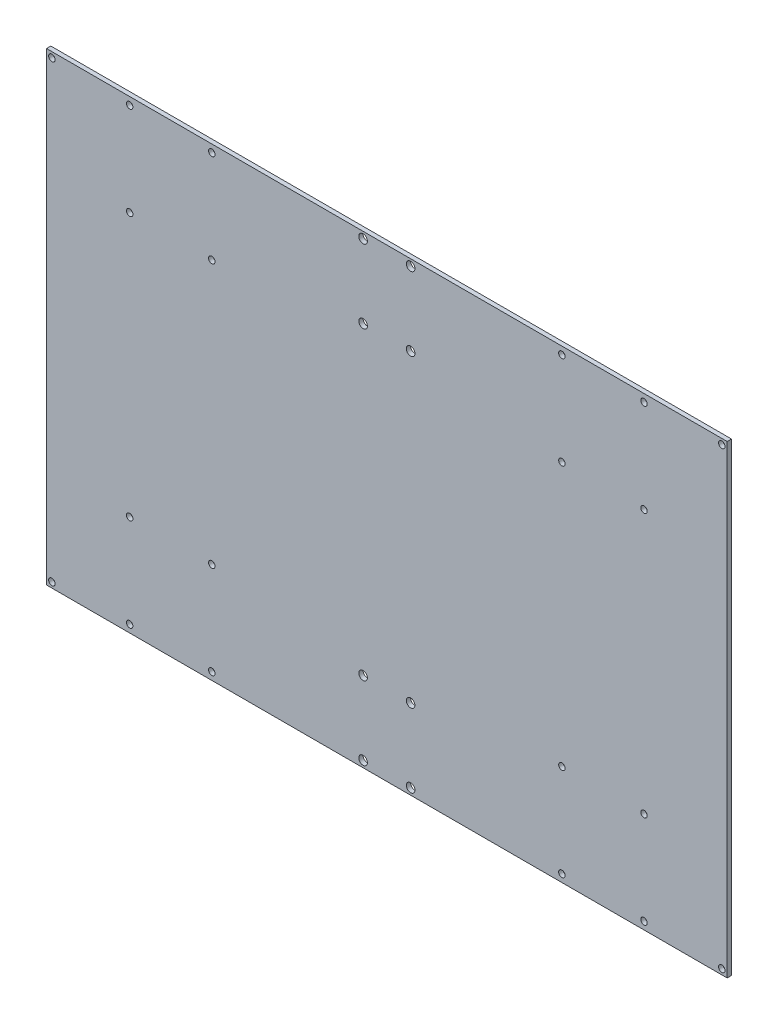
ISO-10303-21;
HEADER;
FILE_DESCRIPTION(('STEP AP214'),'2;1');
FILE_NAME('part.step','',(''),(''),'','','');
FILE_SCHEMA(('AUTOMOTIVE_DESIGN { 1 0 10303 214 1 1 1 1 }'));
ENDSEC;
DATA;
#1=APPLICATION_CONTEXT('core data for automotive mechanical design processes');
#2=APPLICATION_PROTOCOL_DEFINITION('international standard','automotive_design',2000,#1);
#3=PRODUCT_CONTEXT('',#1,'mechanical');
#4=PRODUCT('Part','Part','',(#3));
#5=PRODUCT_RELATED_PRODUCT_CATEGORY('part','',(#4));
#6=PRODUCT_DEFINITION_FORMATION('','',#4);
#7=PRODUCT_DEFINITION_CONTEXT('part definition',#1,'design');
#8=PRODUCT_DEFINITION('design','',#6,#7);
#9=PRODUCT_DEFINITION_SHAPE('','',#8);
#10=(LENGTH_UNIT() NAMED_UNIT(*) SI_UNIT(.MILLI.,.METRE.));
#11=(NAMED_UNIT(*) PLANE_ANGLE_UNIT() SI_UNIT($,.RADIAN.));
#12=(NAMED_UNIT(*) SI_UNIT($,.STERADIAN.) SOLID_ANGLE_UNIT());
#13=UNCERTAINTY_MEASURE_WITH_UNIT(LENGTH_MEASURE(1.E-05),#10,'distance_accuracy_value','');
#14=(GEOMETRIC_REPRESENTATION_CONTEXT(3) GLOBAL_UNCERTAINTY_ASSIGNED_CONTEXT((#13)) GLOBAL_UNIT_ASSIGNED_CONTEXT((#10,
#11,#12)) REPRESENTATION_CONTEXT('',''));
#15=CARTESIAN_POINT('',(0.,0.,0.));
#16=DIRECTION('',(0.,0.,1.));
#17=DIRECTION('',(1.,0.,0.));
#18=AXIS2_PLACEMENT_3D('',#15,#16,#17);
#19=CARTESIAN_POINT('',(157.5,-107.5,2.));
#20=DIRECTION('',(-1.,0.,0.));
#21=DIRECTION('',(0.,0.,1.));
#22=AXIS2_PLACEMENT_3D('',#19,#20,#21);
#23=PLANE('',#22);
#24=DIRECTION('',(0.,1.,0.));
#25=VECTOR('',#24,1.);
#26=CARTESIAN_POINT('',(157.5,-107.5,0.));
#27=LINE('',#26,#25);
#28=CARTESIAN_POINT('',(157.5,-107.5,0.));
#29=VERTEX_POINT('',#28);
#30=CARTESIAN_POINT('',(157.5,107.5,0.));
#31=VERTEX_POINT('',#30);
#32=EDGE_CURVE('E97',#29,#31,#27,.T.);
#33=ORIENTED_EDGE('',*,*,#32,.T.);
#34=DIRECTION('',(0.,0.,-1.));
#35=VECTOR('',#34,1.);
#36=CARTESIAN_POINT('',(157.5,107.5,2.));
#37=LINE('',#36,#35);
#38=CARTESIAN_POINT('',(157.5,107.5,2.));
#39=VERTEX_POINT('',#38);
#40=EDGE_CURVE('E11',#39,#31,#37,.T.);
#41=ORIENTED_EDGE('',*,*,#40,.F.);
#42=DIRECTION('',(0.,1.,0.));
#43=VECTOR('',#42,1.);
#44=CARTESIAN_POINT('',(157.5,-107.5,2.));
#45=LINE('',#44,#43);
#46=CARTESIAN_POINT('',(157.5,-107.5,2.));
#47=VERTEX_POINT('',#46);
#48=EDGE_CURVE('E85',#47,#39,#45,.T.);
#49=ORIENTED_EDGE('',*,*,#48,.F.);
#50=DIRECTION('',(0.,0.,-1.));
#51=VECTOR('',#50,1.);
#52=CARTESIAN_POINT('',(157.5,-107.5,2.));
#53=LINE('',#52,#51);
#54=EDGE_CURVE('E93',#47,#29,#53,.T.);
#55=ORIENTED_EDGE('',*,*,#54,.T.);
#56=EDGE_LOOP('',(#33,#41,#49,#55));
#57=FACE_BOUND('',#56,.T.);
#58=ADVANCED_FACE('F34',(#57),#23,.F.);
#59=CARTESIAN_POINT('',(-157.5,107.5,2.));
#60=DIRECTION('',(0.,-1.,0.));
#61=DIRECTION('',(0.,0.,-1.));
#62=AXIS2_PLACEMENT_3D('',#59,#60,#61);
#63=PLANE('',#62);
#64=DIRECTION('',(-1.,0.,0.));
#65=VECTOR('',#64,1.);
#66=CARTESIAN_POINT('',(-157.5,107.5,0.));
#67=LINE('',#66,#65);
#68=CARTESIAN_POINT('',(-157.5,107.5,0.));
#69=VERTEX_POINT('',#68);
#70=EDGE_CURVE('E89',#31,#69,#67,.T.);
#71=ORIENTED_EDGE('',*,*,#70,.T.);
#72=DIRECTION('',(0.,0.,-1.));
#73=VECTOR('',#72,1.);
#74=CARTESIAN_POINT('',(-157.5,107.5,2.));
#75=LINE('',#74,#73);
#76=CARTESIAN_POINT('',(-157.5,107.5,2.));
#77=VERTEX_POINT('',#76);
#78=EDGE_CURVE('E42',#77,#69,#75,.T.);
#79=ORIENTED_EDGE('',*,*,#78,.F.);
#80=DIRECTION('',(-1.,0.,0.));
#81=VECTOR('',#80,1.);
#82=CARTESIAN_POINT('',(-157.5,107.5,2.));
#83=LINE('',#82,#81);
#84=EDGE_CURVE('E80',#39,#77,#83,.T.);
#85=ORIENTED_EDGE('',*,*,#84,.F.);
#86=ORIENTED_EDGE('',*,*,#40,.T.);
#87=EDGE_LOOP('',(#71,#79,#85,#86));
#88=FACE_BOUND('',#87,.T.);
#89=ADVANCED_FACE('F88',(#88),#63,.F.);
#90=CARTESIAN_POINT('',(-157.5,-107.5,2.));
#91=DIRECTION('',(1.,0.,0.));
#92=DIRECTION('',(0.,0.,-1.));
#93=AXIS2_PLACEMENT_3D('',#90,#91,#92);
#94=PLANE('',#93);
#95=DIRECTION('',(0.,-1.,0.));
#96=VECTOR('',#95,1.);
#97=CARTESIAN_POINT('',(-157.5,-107.5,0.));
#98=LINE('',#97,#96);
#99=CARTESIAN_POINT('',(-157.5,-107.5,0.));
#100=VERTEX_POINT('',#99);
#101=EDGE_CURVE('E67',#69,#100,#98,.T.);
#102=ORIENTED_EDGE('',*,*,#101,.T.);
#103=DIRECTION('',(0.,0.,-1.));
#104=VECTOR('',#103,1.);
#105=CARTESIAN_POINT('',(-157.5,-107.5,2.));
#106=LINE('',#105,#104);
#107=CARTESIAN_POINT('',(-157.5,-107.5,2.));
#108=VERTEX_POINT('',#107);
#109=EDGE_CURVE('E90',#108,#100,#106,.T.);
#110=ORIENTED_EDGE('',*,*,#109,.F.);
#111=DIRECTION('',(0.,-1.,0.));
#112=VECTOR('',#111,1.);
#113=CARTESIAN_POINT('',(-157.5,-107.5,2.));
#114=LINE('',#113,#112);
#115=EDGE_CURVE('E83',#77,#108,#114,.T.);
#116=ORIENTED_EDGE('',*,*,#115,.F.);
#117=ORIENTED_EDGE('',*,*,#78,.T.);
#118=EDGE_LOOP('',(#102,#110,#116,#117));
#119=FACE_BOUND('',#118,.T.);
#120=ADVANCED_FACE('F91',(#119),#94,.F.);
#121=CARTESIAN_POINT('',(-157.5,-107.5,2.));
#122=DIRECTION('',(0.,1.,0.));
#123=DIRECTION('',(0.,0.,1.));
#124=AXIS2_PLACEMENT_3D('',#121,#122,#123);
#125=PLANE('',#124);
#126=DIRECTION('',(1.,0.,0.));
#127=VECTOR('',#126,1.);
#128=CARTESIAN_POINT('',(-157.5,-107.5,0.));
#129=LINE('',#128,#127);
#130=EDGE_CURVE('E73',#100,#29,#129,.T.);
#131=ORIENTED_EDGE('',*,*,#130,.T.);
#132=ORIENTED_EDGE('',*,*,#54,.F.);
#133=DIRECTION('',(1.,0.,0.));
#134=VECTOR('',#133,1.);
#135=CARTESIAN_POINT('',(-157.5,-107.5,2.));
#136=LINE('',#135,#134);
#137=EDGE_CURVE('E50',#108,#47,#136,.T.);
#138=ORIENTED_EDGE('',*,*,#137,.F.);
#139=ORIENTED_EDGE('',*,*,#109,.T.);
#140=EDGE_LOOP('',(#131,#132,#138,#139));
#141=FACE_BOUND('',#140,.T.);
#142=ADVANCED_FACE('F105',(#141),#125,.F.);
#143=CARTESIAN_POINT('',(0.,0.,2.));
#144=DIRECTION('',(0.,0.,-1.));
#145=DIRECTION('',(-1.,0.,0.));
#146=AXIS2_PLACEMENT_3D('',#143,#144,#145);
#147=PLANE('',#146);
#148=CARTESIAN_POINT('',(11.0000000000002,-104.5,2.));
#149=DIRECTION('',(0.,0.,1.));
#150=DIRECTION('',(1.,0.,0.));
#151=AXIS2_PLACEMENT_3D('',#148,#149,#150);
#152=CIRCLE('',#151,2.00000000000001);
#153=CARTESIAN_POINT('',(13.0000000000002,-104.5,2.));
#154=VERTEX_POINT('',#153);
#155=EDGE_CURVE('E273',#154,#154,#152,.T.);
#156=ORIENTED_EDGE('',*,*,#155,.F.);
#157=EDGE_LOOP('',(#156));
#158=FACE_BOUND('',#157,.T.);
#159=CARTESIAN_POINT('',(-10.9999999999998,-104.5,2.));
#160=DIRECTION('',(0.,0.,1.));
#161=DIRECTION('',(1.,0.,0.));
#162=AXIS2_PLACEMENT_3D('',#159,#160,#161);
#163=CIRCLE('',#162,2.00000000000001);
#164=CARTESIAN_POINT('',(-8.99999999999978,-104.5,2.));
#165=VERTEX_POINT('',#164);
#166=EDGE_CURVE('E267',#165,#165,#163,.T.);
#167=ORIENTED_EDGE('',*,*,#166,.F.);
#168=EDGE_LOOP('',(#167));
#169=FACE_BOUND('',#168,.T.);
#170=CARTESIAN_POINT('',(11.0000000000002,-70.5,2.));
#171=DIRECTION('',(0.,0.,1.));
#172=DIRECTION('',(1.,0.,0.));
#173=AXIS2_PLACEMENT_3D('',#170,#171,#172);
#174=CIRCLE('',#173,2.);
#175=CARTESIAN_POINT('',(13.0000000000002,-70.5,2.));
#176=VERTEX_POINT('',#175);
#177=EDGE_CURVE('E261',#176,#176,#174,.T.);
#178=ORIENTED_EDGE('',*,*,#177,.F.);
#179=EDGE_LOOP('',(#178));
#180=FACE_BOUND('',#179,.T.);
#181=CARTESIAN_POINT('',(-10.9999999999998,-70.5,2.));
#182=DIRECTION('',(0.,0.,1.));
#183=DIRECTION('',(1.,0.,0.));
#184=AXIS2_PLACEMENT_3D('',#181,#182,#183);
#185=CIRCLE('',#184,2.);
#186=CARTESIAN_POINT('',(-8.99999999999977,-70.5,2.));
#187=VERTEX_POINT('',#186);
#188=EDGE_CURVE('E255',#187,#187,#185,.T.);
#189=ORIENTED_EDGE('',*,*,#188,.F.);
#190=EDGE_LOOP('',(#189));
#191=FACE_BOUND('',#190,.T.);
#192=CARTESIAN_POINT('',(11.0000000000003,70.4999999999999,2.));
#193=DIRECTION('',(0.,0.,1.));
#194=DIRECTION('',(1.,0.,0.));
#195=AXIS2_PLACEMENT_3D('',#192,#193,#194);
#196=CIRCLE('',#195,2.);
#197=CARTESIAN_POINT('',(13.0000000000003,70.4999999999999,2.));
#198=VERTEX_POINT('',#197);
#199=EDGE_CURVE('E249',#198,#198,#196,.T.);
#200=ORIENTED_EDGE('',*,*,#199,.F.);
#201=EDGE_LOOP('',(#200));
#202=FACE_BOUND('',#201,.T.);
#203=CARTESIAN_POINT('',(-10.9999999999997,70.4999999999998,2.));
#204=DIRECTION('',(0.,0.,1.));
#205=DIRECTION('',(1.,0.,0.));
#206=AXIS2_PLACEMENT_3D('',#203,#204,#205);
#207=CIRCLE('',#206,2.);
#208=CARTESIAN_POINT('',(-8.99999999999967,70.4999999999998,2.));
#209=VERTEX_POINT('',#208);
#210=EDGE_CURVE('E243',#209,#209,#207,.T.);
#211=ORIENTED_EDGE('',*,*,#210,.F.);
#212=EDGE_LOOP('',(#211));
#213=FACE_BOUND('',#212,.T.);
#214=CARTESIAN_POINT('',(11.0000000000003,104.5,2.));
#215=DIRECTION('',(0.,0.,1.));
#216=DIRECTION('',(1.,0.,0.));
#217=AXIS2_PLACEMENT_3D('',#214,#215,#216);
#218=CIRCLE('',#217,2.);
#219=CARTESIAN_POINT('',(13.0000000000003,104.5,2.));
#220=VERTEX_POINT('',#219);
#221=EDGE_CURVE('E237',#220,#220,#218,.T.);
#222=ORIENTED_EDGE('',*,*,#221,.F.);
#223=EDGE_LOOP('',(#222));
#224=FACE_BOUND('',#223,.T.);
#225=CARTESIAN_POINT('',(-10.9999999999997,104.5,2.));
#226=DIRECTION('',(0.,0.,1.));
#227=DIRECTION('',(1.,0.,0.));
#228=AXIS2_PLACEMENT_3D('',#225,#226,#227);
#229=CIRCLE('',#228,2.);
#230=CARTESIAN_POINT('',(-8.99999999999967,104.5,2.));
#231=VERTEX_POINT('',#230);
#232=EDGE_CURVE('E231',#231,#231,#229,.T.);
#233=ORIENTED_EDGE('',*,*,#232,.F.);
#234=EDGE_LOOP('',(#233));
#235=FACE_BOUND('',#234,.T.);
#236=CARTESIAN_POINT('',(-119.,-104.,2.));
#237=DIRECTION('',(0.,0.,1.));
#238=DIRECTION('',(1.,0.,0.));
#239=AXIS2_PLACEMENT_3D('',#236,#237,#238);
#240=CIRCLE('',#239,1.5);
#241=CARTESIAN_POINT('',(-117.5,-104.,2.));
#242=VERTEX_POINT('',#241);
#243=EDGE_CURVE('E225',#242,#242,#240,.T.);
#244=ORIENTED_EDGE('',*,*,#243,.F.);
#245=EDGE_LOOP('',(#244));
#246=FACE_BOUND('',#245,.T.);
#247=CARTESIAN_POINT('',(-80.9999999999999,-104.,2.));
#248=DIRECTION('',(0.,0.,1.));
#249=DIRECTION('',(1.,0.,0.));
#250=AXIS2_PLACEMENT_3D('',#247,#248,#249);
#251=CIRCLE('',#250,1.5);
#252=CARTESIAN_POINT('',(-79.4999999999999,-104.,2.));
#253=VERTEX_POINT('',#252);
#254=EDGE_CURVE('E219',#253,#253,#251,.T.);
#255=ORIENTED_EDGE('',*,*,#254,.F.);
#256=EDGE_LOOP('',(#255));
#257=FACE_BOUND('',#256,.T.);
#258=CARTESIAN_POINT('',(-80.9999999999999,-61.,2.));
#259=DIRECTION('',(0.,0.,1.));
#260=DIRECTION('',(1.,0.,0.));
#261=AXIS2_PLACEMENT_3D('',#258,#259,#260);
#262=CIRCLE('',#261,1.5);
#263=CARTESIAN_POINT('',(-79.4999999999999,-61.,2.));
#264=VERTEX_POINT('',#263);
#265=EDGE_CURVE('E213',#264,#264,#262,.T.);
#266=ORIENTED_EDGE('',*,*,#265,.F.);
#267=EDGE_LOOP('',(#266));
#268=FACE_BOUND('',#267,.T.);
#269=CARTESIAN_POINT('',(-119.,-61.,2.));
#270=DIRECTION('',(0.,0.,1.));
#271=DIRECTION('',(1.,0.,0.));
#272=AXIS2_PLACEMENT_3D('',#269,#270,#271);
#273=CIRCLE('',#272,1.5);
#274=CARTESIAN_POINT('',(-117.5,-61.,2.));
#275=VERTEX_POINT('',#274);
#276=EDGE_CURVE('E207',#275,#275,#273,.T.);
#277=ORIENTED_EDGE('',*,*,#276,.F.);
#278=EDGE_LOOP('',(#277));
#279=FACE_BOUND('',#278,.T.);
#280=CARTESIAN_POINT('',(81.0000000000001,-104.,2.));
#281=DIRECTION('',(0.,0.,1.));
#282=DIRECTION('',(1.,0.,0.));
#283=AXIS2_PLACEMENT_3D('',#280,#281,#282);
#284=CIRCLE('',#283,1.5);
#285=CARTESIAN_POINT('',(82.5000000000001,-104.,2.));
#286=VERTEX_POINT('',#285);
#287=EDGE_CURVE('E201',#286,#286,#284,.T.);
#288=ORIENTED_EDGE('',*,*,#287,.F.);
#289=EDGE_LOOP('',(#288));
#290=FACE_BOUND('',#289,.T.);
#291=CARTESIAN_POINT('',(119.,-104.,2.));
#292=DIRECTION('',(0.,0.,1.));
#293=DIRECTION('',(1.,0.,0.));
#294=AXIS2_PLACEMENT_3D('',#291,#292,#293);
#295=CIRCLE('',#294,1.5);
#296=CARTESIAN_POINT('',(120.5,-104.,2.));
#297=VERTEX_POINT('',#296);
#298=EDGE_CURVE('E195',#297,#297,#295,.T.);
#299=ORIENTED_EDGE('',*,*,#298,.F.);
#300=EDGE_LOOP('',(#299));
#301=FACE_BOUND('',#300,.T.);
#302=CARTESIAN_POINT('',(119.,-61.,2.));
#303=DIRECTION('',(0.,0.,1.));
#304=DIRECTION('',(1.,0.,0.));
#305=AXIS2_PLACEMENT_3D('',#302,#303,#304);
#306=CIRCLE('',#305,1.5);
#307=CARTESIAN_POINT('',(120.5,-61.,2.));
#308=VERTEX_POINT('',#307);
#309=EDGE_CURVE('E189',#308,#308,#306,.T.);
#310=ORIENTED_EDGE('',*,*,#309,.F.);
#311=EDGE_LOOP('',(#310));
#312=FACE_BOUND('',#311,.T.);
#313=CARTESIAN_POINT('',(81.0000000000001,-61.,2.));
#314=DIRECTION('',(0.,0.,1.));
#315=DIRECTION('',(1.,0.,0.));
#316=AXIS2_PLACEMENT_3D('',#313,#314,#315);
#317=CIRCLE('',#316,1.5);
#318=CARTESIAN_POINT('',(82.5000000000001,-61.,2.));
#319=VERTEX_POINT('',#318);
#320=EDGE_CURVE('E183',#319,#319,#317,.T.);
#321=ORIENTED_EDGE('',*,*,#320,.F.);
#322=EDGE_LOOP('',(#321));
#323=FACE_BOUND('',#322,.T.);
#324=CARTESIAN_POINT('',(81.0000000000001,61.,2.));
#325=DIRECTION('',(0.,0.,1.));
#326=DIRECTION('',(1.,0.,0.));
#327=AXIS2_PLACEMENT_3D('',#324,#325,#326);
#328=CIRCLE('',#327,1.5);
#329=CARTESIAN_POINT('',(82.5000000000001,61.,2.));
#330=VERTEX_POINT('',#329);
#331=EDGE_CURVE('E177',#330,#330,#328,.T.);
#332=ORIENTED_EDGE('',*,*,#331,.F.);
#333=EDGE_LOOP('',(#332));
#334=FACE_BOUND('',#333,.T.);
#335=CARTESIAN_POINT('',(119.,61.,2.));
#336=DIRECTION('',(0.,0.,1.));
#337=DIRECTION('',(1.,0.,0.));
#338=AXIS2_PLACEMENT_3D('',#335,#336,#337);
#339=CIRCLE('',#338,1.5);
#340=CARTESIAN_POINT('',(120.5,61.,2.));
#341=VERTEX_POINT('',#340);
#342=EDGE_CURVE('E171',#341,#341,#339,.T.);
#343=ORIENTED_EDGE('',*,*,#342,.F.);
#344=EDGE_LOOP('',(#343));
#345=FACE_BOUND('',#344,.T.);
#346=CARTESIAN_POINT('',(119.,104.,2.));
#347=DIRECTION('',(0.,0.,1.));
#348=DIRECTION('',(1.,0.,0.));
#349=AXIS2_PLACEMENT_3D('',#346,#347,#348);
#350=CIRCLE('',#349,1.5);
#351=CARTESIAN_POINT('',(120.5,104.,2.));
#352=VERTEX_POINT('',#351);
#353=EDGE_CURVE('E165',#352,#352,#350,.T.);
#354=ORIENTED_EDGE('',*,*,#353,.F.);
#355=EDGE_LOOP('',(#354));
#356=FACE_BOUND('',#355,.T.);
#357=CARTESIAN_POINT('',(81.0000000000001,104.,2.));
#358=DIRECTION('',(0.,0.,1.));
#359=DIRECTION('',(1.,0.,0.));
#360=AXIS2_PLACEMENT_3D('',#357,#358,#359);
#361=CIRCLE('',#360,1.50000000000001);
#362=CARTESIAN_POINT('',(82.5000000000001,104.,2.));
#363=VERTEX_POINT('',#362);
#364=EDGE_CURVE('E159',#363,#363,#361,.T.);
#365=ORIENTED_EDGE('',*,*,#364,.F.);
#366=EDGE_LOOP('',(#365));
#367=FACE_BOUND('',#366,.T.);
#368=CARTESIAN_POINT('',(-81.,61.,2.));
#369=DIRECTION('',(0.,0.,1.));
#370=DIRECTION('',(1.,0.,0.));
#371=AXIS2_PLACEMENT_3D('',#368,#369,#370);
#372=CIRCLE('',#371,1.50000000000001);
#373=CARTESIAN_POINT('',(-79.4999999999999,61.,2.));
#374=VERTEX_POINT('',#373);
#375=EDGE_CURVE('E153',#374,#374,#372,.T.);
#376=ORIENTED_EDGE('',*,*,#375,.F.);
#377=EDGE_LOOP('',(#376));
#378=FACE_BOUND('',#377,.T.);
#379=CARTESIAN_POINT('',(-119.,61.,2.));
#380=DIRECTION('',(0.,0.,1.));
#381=DIRECTION('',(1.,0.,0.));
#382=AXIS2_PLACEMENT_3D('',#379,#380,#381);
#383=CIRCLE('',#382,1.5);
#384=CARTESIAN_POINT('',(-117.5,61.,2.));
#385=VERTEX_POINT('',#384);
#386=EDGE_CURVE('E147',#385,#385,#383,.T.);
#387=ORIENTED_EDGE('',*,*,#386,.F.);
#388=EDGE_LOOP('',(#387));
#389=FACE_BOUND('',#388,.T.);
#390=CARTESIAN_POINT('',(-80.9999999999999,104.,2.));
#391=DIRECTION('',(0.,0.,1.));
#392=DIRECTION('',(1.,0.,0.));
#393=AXIS2_PLACEMENT_3D('',#390,#391,#392);
#394=CIRCLE('',#393,1.5);
#395=CARTESIAN_POINT('',(-79.4999999999999,104.,2.));
#396=VERTEX_POINT('',#395);
#397=EDGE_CURVE('E141',#396,#396,#394,.T.);
#398=ORIENTED_EDGE('',*,*,#397,.F.);
#399=EDGE_LOOP('',(#398));
#400=FACE_BOUND('',#399,.T.);
#401=CARTESIAN_POINT('',(-119.,104.,2.));
#402=DIRECTION('',(0.,0.,1.));
#403=DIRECTION('',(1.,0.,0.));
#404=AXIS2_PLACEMENT_3D('',#401,#402,#403);
#405=CIRCLE('',#404,1.5);
#406=CARTESIAN_POINT('',(-117.5,104.,2.));
#407=VERTEX_POINT('',#406);
#408=EDGE_CURVE('E135',#407,#407,#405,.T.);
#409=ORIENTED_EDGE('',*,*,#408,.F.);
#410=EDGE_LOOP('',(#409));
#411=FACE_BOUND('',#410,.T.);
#412=CARTESIAN_POINT('',(-155.,-105.,2.));
#413=DIRECTION('',(0.,0.,1.));
#414=DIRECTION('',(-1.,0.,0.));
#415=AXIS2_PLACEMENT_3D('',#412,#413,#414);
#416=CIRCLE('',#415,1.5);
#417=CARTESIAN_POINT('',(-156.5,-105.,2.));
#418=VERTEX_POINT('',#417);
#419=EDGE_CURVE('E129',#418,#418,#416,.T.);
#420=ORIENTED_EDGE('',*,*,#419,.F.);
#421=EDGE_LOOP('',(#420));
#422=FACE_BOUND('',#421,.T.);
#423=CARTESIAN_POINT('',(155.,-105.,2.));
#424=DIRECTION('',(0.,0.,1.));
#425=DIRECTION('',(1.,0.,0.));
#426=AXIS2_PLACEMENT_3D('',#423,#424,#425);
#427=CIRCLE('',#426,1.5);
#428=CARTESIAN_POINT('',(156.5,-105.,2.));
#429=VERTEX_POINT('',#428);
#430=EDGE_CURVE('E123',#429,#429,#427,.T.);
#431=ORIENTED_EDGE('',*,*,#430,.F.);
#432=EDGE_LOOP('',(#431));
#433=FACE_BOUND('',#432,.T.);
#434=CARTESIAN_POINT('',(155.,105.,2.));
#435=DIRECTION('',(0.,0.,1.));
#436=DIRECTION('',(-1.,0.,0.));
#437=AXIS2_PLACEMENT_3D('',#434,#435,#436);
#438=CIRCLE('',#437,1.5);
#439=CARTESIAN_POINT('',(153.5,105.,2.));
#440=VERTEX_POINT('',#439);
#441=EDGE_CURVE('E117',#440,#440,#438,.T.);
#442=ORIENTED_EDGE('',*,*,#441,.F.);
#443=EDGE_LOOP('',(#442));
#444=FACE_BOUND('',#443,.T.);
#445=CARTESIAN_POINT('',(-155.,105.,2.));
#446=DIRECTION('',(0.,0.,1.));
#447=DIRECTION('',(1.,0.,0.));
#448=AXIS2_PLACEMENT_3D('',#445,#446,#447);
#449=CIRCLE('',#448,1.5);
#450=CARTESIAN_POINT('',(-153.5,105.,2.));
#451=VERTEX_POINT('',#450);
#452=EDGE_CURVE('E111',#451,#451,#449,.T.);
#453=ORIENTED_EDGE('',*,*,#452,.F.);
#454=EDGE_LOOP('',(#453));
#455=FACE_BOUND('',#454,.T.);
#456=ORIENTED_EDGE('',*,*,#48,.T.);
#457=ORIENTED_EDGE('',*,*,#84,.T.);
#458=ORIENTED_EDGE('',*,*,#115,.T.);
#459=ORIENTED_EDGE('',*,*,#137,.T.);
#460=EDGE_LOOP('',(#456,#457,#458,#459));
#461=FACE_BOUND('',#460,.T.);
#462=ADVANCED_FACE('F81',(#158,#169,#180,#191,#202,#213,#224,#235,#246,#257,#268,#279,#290,#301,
#312,#323,#334,#345,#356,#367,#378,#389,#400,#411,#422,#433,#444,#455,#461),#147,.F.);
#463=CARTESIAN_POINT('',(0.,0.,0.));
#464=DIRECTION('',(0.,0.,-1.));
#465=DIRECTION('',(-1.,0.,0.));
#466=AXIS2_PLACEMENT_3D('',#463,#464,#465);
#467=PLANE('',#466);
#468=CARTESIAN_POINT('',(11.0000000000002,-104.5,0.));
#469=DIRECTION('',(0.,0.,1.));
#470=DIRECTION('',(1.,0.,0.));
#471=AXIS2_PLACEMENT_3D('',#468,#469,#470);
#472=CIRCLE('',#471,2.00000000000001);
#473=CARTESIAN_POINT('',(13.0000000000002,-104.5,0.));
#474=VERTEX_POINT('',#473);
#475=EDGE_CURVE('E270',#474,#474,#472,.T.);
#476=ORIENTED_EDGE('',*,*,#475,.T.);
#477=EDGE_LOOP('',(#476));
#478=FACE_BOUND('',#477,.T.);
#479=CARTESIAN_POINT('',(-10.9999999999998,-104.5,0.));
#480=DIRECTION('',(0.,0.,1.));
#481=DIRECTION('',(1.,0.,0.));
#482=AXIS2_PLACEMENT_3D('',#479,#480,#481);
#483=CIRCLE('',#482,2.00000000000001);
#484=CARTESIAN_POINT('',(-8.99999999999978,-104.5,0.));
#485=VERTEX_POINT('',#484);
#486=EDGE_CURVE('E264',#485,#485,#483,.T.);
#487=ORIENTED_EDGE('',*,*,#486,.T.);
#488=EDGE_LOOP('',(#487));
#489=FACE_BOUND('',#488,.T.);
#490=CARTESIAN_POINT('',(11.0000000000002,-70.5,0.));
#491=DIRECTION('',(0.,0.,1.));
#492=DIRECTION('',(1.,0.,0.));
#493=AXIS2_PLACEMENT_3D('',#490,#491,#492);
#494=CIRCLE('',#493,2.);
#495=CARTESIAN_POINT('',(13.0000000000002,-70.5,0.));
#496=VERTEX_POINT('',#495);
#497=EDGE_CURVE('E258',#496,#496,#494,.T.);
#498=ORIENTED_EDGE('',*,*,#497,.T.);
#499=EDGE_LOOP('',(#498));
#500=FACE_BOUND('',#499,.T.);
#501=CARTESIAN_POINT('',(-10.9999999999998,-70.5,0.));
#502=DIRECTION('',(0.,0.,1.));
#503=DIRECTION('',(1.,0.,0.));
#504=AXIS2_PLACEMENT_3D('',#501,#502,#503);
#505=CIRCLE('',#504,2.);
#506=CARTESIAN_POINT('',(-8.99999999999977,-70.5,0.));
#507=VERTEX_POINT('',#506);
#508=EDGE_CURVE('E252',#507,#507,#505,.T.);
#509=ORIENTED_EDGE('',*,*,#508,.T.);
#510=EDGE_LOOP('',(#509));
#511=FACE_BOUND('',#510,.T.);
#512=CARTESIAN_POINT('',(11.0000000000003,70.4999999999999,0.));
#513=DIRECTION('',(0.,0.,1.));
#514=DIRECTION('',(1.,0.,0.));
#515=AXIS2_PLACEMENT_3D('',#512,#513,#514);
#516=CIRCLE('',#515,2.);
#517=CARTESIAN_POINT('',(13.0000000000003,70.4999999999999,0.));
#518=VERTEX_POINT('',#517);
#519=EDGE_CURVE('E246',#518,#518,#516,.T.);
#520=ORIENTED_EDGE('',*,*,#519,.T.);
#521=EDGE_LOOP('',(#520));
#522=FACE_BOUND('',#521,.T.);
#523=CARTESIAN_POINT('',(-10.9999999999997,70.4999999999998,0.));
#524=DIRECTION('',(0.,0.,1.));
#525=DIRECTION('',(1.,0.,0.));
#526=AXIS2_PLACEMENT_3D('',#523,#524,#525);
#527=CIRCLE('',#526,2.);
#528=CARTESIAN_POINT('',(-8.99999999999967,70.4999999999998,0.));
#529=VERTEX_POINT('',#528);
#530=EDGE_CURVE('E240',#529,#529,#527,.T.);
#531=ORIENTED_EDGE('',*,*,#530,.T.);
#532=EDGE_LOOP('',(#531));
#533=FACE_BOUND('',#532,.T.);
#534=CARTESIAN_POINT('',(11.0000000000003,104.5,0.));
#535=DIRECTION('',(0.,0.,1.));
#536=DIRECTION('',(1.,0.,0.));
#537=AXIS2_PLACEMENT_3D('',#534,#535,#536);
#538=CIRCLE('',#537,2.);
#539=CARTESIAN_POINT('',(13.0000000000003,104.5,0.));
#540=VERTEX_POINT('',#539);
#541=EDGE_CURVE('E234',#540,#540,#538,.T.);
#542=ORIENTED_EDGE('',*,*,#541,.T.);
#543=EDGE_LOOP('',(#542));
#544=FACE_BOUND('',#543,.T.);
#545=CARTESIAN_POINT('',(-10.9999999999997,104.5,0.));
#546=DIRECTION('',(0.,0.,1.));
#547=DIRECTION('',(1.,0.,0.));
#548=AXIS2_PLACEMENT_3D('',#545,#546,#547);
#549=CIRCLE('',#548,2.);
#550=CARTESIAN_POINT('',(-8.99999999999967,104.5,0.));
#551=VERTEX_POINT('',#550);
#552=EDGE_CURVE('E228',#551,#551,#549,.T.);
#553=ORIENTED_EDGE('',*,*,#552,.T.);
#554=EDGE_LOOP('',(#553));
#555=FACE_BOUND('',#554,.T.);
#556=CARTESIAN_POINT('',(-119.,-104.,0.));
#557=DIRECTION('',(0.,0.,1.));
#558=DIRECTION('',(1.,0.,0.));
#559=AXIS2_PLACEMENT_3D('',#556,#557,#558);
#560=CIRCLE('',#559,1.5);
#561=CARTESIAN_POINT('',(-117.5,-104.,0.));
#562=VERTEX_POINT('',#561);
#563=EDGE_CURVE('E222',#562,#562,#560,.T.);
#564=ORIENTED_EDGE('',*,*,#563,.T.);
#565=EDGE_LOOP('',(#564));
#566=FACE_BOUND('',#565,.T.);
#567=CARTESIAN_POINT('',(-80.9999999999999,-104.,0.));
#568=DIRECTION('',(0.,0.,1.));
#569=DIRECTION('',(1.,0.,0.));
#570=AXIS2_PLACEMENT_3D('',#567,#568,#569);
#571=CIRCLE('',#570,1.5);
#572=CARTESIAN_POINT('',(-79.4999999999999,-104.,0.));
#573=VERTEX_POINT('',#572);
#574=EDGE_CURVE('E216',#573,#573,#571,.T.);
#575=ORIENTED_EDGE('',*,*,#574,.T.);
#576=EDGE_LOOP('',(#575));
#577=FACE_BOUND('',#576,.T.);
#578=CARTESIAN_POINT('',(-80.9999999999999,-61.,0.));
#579=DIRECTION('',(0.,0.,1.));
#580=DIRECTION('',(1.,0.,0.));
#581=AXIS2_PLACEMENT_3D('',#578,#579,#580);
#582=CIRCLE('',#581,1.5);
#583=CARTESIAN_POINT('',(-79.4999999999999,-61.,0.));
#584=VERTEX_POINT('',#583);
#585=EDGE_CURVE('E210',#584,#584,#582,.T.);
#586=ORIENTED_EDGE('',*,*,#585,.T.);
#587=EDGE_LOOP('',(#586));
#588=FACE_BOUND('',#587,.T.);
#589=CARTESIAN_POINT('',(-119.,-61.,0.));
#590=DIRECTION('',(0.,0.,1.));
#591=DIRECTION('',(1.,0.,0.));
#592=AXIS2_PLACEMENT_3D('',#589,#590,#591);
#593=CIRCLE('',#592,1.5);
#594=CARTESIAN_POINT('',(-117.5,-61.,0.));
#595=VERTEX_POINT('',#594);
#596=EDGE_CURVE('E204',#595,#595,#593,.T.);
#597=ORIENTED_EDGE('',*,*,#596,.T.);
#598=EDGE_LOOP('',(#597));
#599=FACE_BOUND('',#598,.T.);
#600=CARTESIAN_POINT('',(81.0000000000001,-104.,0.));
#601=DIRECTION('',(0.,0.,1.));
#602=DIRECTION('',(1.,0.,0.));
#603=AXIS2_PLACEMENT_3D('',#600,#601,#602);
#604=CIRCLE('',#603,1.5);
#605=CARTESIAN_POINT('',(82.5000000000001,-104.,0.));
#606=VERTEX_POINT('',#605);
#607=EDGE_CURVE('E198',#606,#606,#604,.T.);
#608=ORIENTED_EDGE('',*,*,#607,.T.);
#609=EDGE_LOOP('',(#608));
#610=FACE_BOUND('',#609,.T.);
#611=CARTESIAN_POINT('',(119.,-104.,0.));
#612=DIRECTION('',(0.,0.,1.));
#613=DIRECTION('',(1.,0.,0.));
#614=AXIS2_PLACEMENT_3D('',#611,#612,#613);
#615=CIRCLE('',#614,1.5);
#616=CARTESIAN_POINT('',(120.5,-104.,0.));
#617=VERTEX_POINT('',#616);
#618=EDGE_CURVE('E192',#617,#617,#615,.T.);
#619=ORIENTED_EDGE('',*,*,#618,.T.);
#620=EDGE_LOOP('',(#619));
#621=FACE_BOUND('',#620,.T.);
#622=CARTESIAN_POINT('',(119.,-61.,0.));
#623=DIRECTION('',(0.,0.,1.));
#624=DIRECTION('',(1.,0.,0.));
#625=AXIS2_PLACEMENT_3D('',#622,#623,#624);
#626=CIRCLE('',#625,1.5);
#627=CARTESIAN_POINT('',(120.5,-61.,0.));
#628=VERTEX_POINT('',#627);
#629=EDGE_CURVE('E186',#628,#628,#626,.T.);
#630=ORIENTED_EDGE('',*,*,#629,.T.);
#631=EDGE_LOOP('',(#630));
#632=FACE_BOUND('',#631,.T.);
#633=CARTESIAN_POINT('',(81.0000000000001,-61.,0.));
#634=DIRECTION('',(0.,0.,1.));
#635=DIRECTION('',(1.,0.,0.));
#636=AXIS2_PLACEMENT_3D('',#633,#634,#635);
#637=CIRCLE('',#636,1.5);
#638=CARTESIAN_POINT('',(82.5000000000001,-61.,0.));
#639=VERTEX_POINT('',#638);
#640=EDGE_CURVE('E180',#639,#639,#637,.T.);
#641=ORIENTED_EDGE('',*,*,#640,.T.);
#642=EDGE_LOOP('',(#641));
#643=FACE_BOUND('',#642,.T.);
#644=CARTESIAN_POINT('',(81.0000000000001,61.,0.));
#645=DIRECTION('',(0.,0.,1.));
#646=DIRECTION('',(1.,0.,0.));
#647=AXIS2_PLACEMENT_3D('',#644,#645,#646);
#648=CIRCLE('',#647,1.5);
#649=CARTESIAN_POINT('',(82.5000000000001,61.,0.));
#650=VERTEX_POINT('',#649);
#651=EDGE_CURVE('E174',#650,#650,#648,.T.);
#652=ORIENTED_EDGE('',*,*,#651,.T.);
#653=EDGE_LOOP('',(#652));
#654=FACE_BOUND('',#653,.T.);
#655=CARTESIAN_POINT('',(119.,61.,0.));
#656=DIRECTION('',(0.,0.,1.));
#657=DIRECTION('',(1.,0.,0.));
#658=AXIS2_PLACEMENT_3D('',#655,#656,#657);
#659=CIRCLE('',#658,1.5);
#660=CARTESIAN_POINT('',(120.5,61.,0.));
#661=VERTEX_POINT('',#660);
#662=EDGE_CURVE('E168',#661,#661,#659,.T.);
#663=ORIENTED_EDGE('',*,*,#662,.T.);
#664=EDGE_LOOP('',(#663));
#665=FACE_BOUND('',#664,.T.);
#666=CARTESIAN_POINT('',(119.,104.,0.));
#667=DIRECTION('',(0.,0.,1.));
#668=DIRECTION('',(1.,0.,0.));
#669=AXIS2_PLACEMENT_3D('',#666,#667,#668);
#670=CIRCLE('',#669,1.5);
#671=CARTESIAN_POINT('',(120.5,104.,0.));
#672=VERTEX_POINT('',#671);
#673=EDGE_CURVE('E162',#672,#672,#670,.T.);
#674=ORIENTED_EDGE('',*,*,#673,.T.);
#675=EDGE_LOOP('',(#674));
#676=FACE_BOUND('',#675,.T.);
#677=CARTESIAN_POINT('',(81.0000000000001,104.,0.));
#678=DIRECTION('',(0.,0.,1.));
#679=DIRECTION('',(1.,0.,0.));
#680=AXIS2_PLACEMENT_3D('',#677,#678,#679);
#681=CIRCLE('',#680,1.50000000000001);
#682=CARTESIAN_POINT('',(82.5000000000001,104.,0.));
#683=VERTEX_POINT('',#682);
#684=EDGE_CURVE('E156',#683,#683,#681,.T.);
#685=ORIENTED_EDGE('',*,*,#684,.T.);
#686=EDGE_LOOP('',(#685));
#687=FACE_BOUND('',#686,.T.);
#688=CARTESIAN_POINT('',(-81.,61.,0.));
#689=DIRECTION('',(0.,0.,1.));
#690=DIRECTION('',(1.,0.,0.));
#691=AXIS2_PLACEMENT_3D('',#688,#689,#690);
#692=CIRCLE('',#691,1.50000000000001);
#693=CARTESIAN_POINT('',(-79.4999999999999,61.,0.));
#694=VERTEX_POINT('',#693);
#695=EDGE_CURVE('E150',#694,#694,#692,.T.);
#696=ORIENTED_EDGE('',*,*,#695,.T.);
#697=EDGE_LOOP('',(#696));
#698=FACE_BOUND('',#697,.T.);
#699=CARTESIAN_POINT('',(-119.,61.,0.));
#700=DIRECTION('',(0.,0.,1.));
#701=DIRECTION('',(1.,0.,0.));
#702=AXIS2_PLACEMENT_3D('',#699,#700,#701);
#703=CIRCLE('',#702,1.5);
#704=CARTESIAN_POINT('',(-117.5,61.,0.));
#705=VERTEX_POINT('',#704);
#706=EDGE_CURVE('E144',#705,#705,#703,.T.);
#707=ORIENTED_EDGE('',*,*,#706,.T.);
#708=EDGE_LOOP('',(#707));
#709=FACE_BOUND('',#708,.T.);
#710=CARTESIAN_POINT('',(-80.9999999999999,104.,0.));
#711=DIRECTION('',(0.,0.,1.));
#712=DIRECTION('',(1.,0.,0.));
#713=AXIS2_PLACEMENT_3D('',#710,#711,#712);
#714=CIRCLE('',#713,1.5);
#715=CARTESIAN_POINT('',(-79.4999999999999,104.,0.));
#716=VERTEX_POINT('',#715);
#717=EDGE_CURVE('E138',#716,#716,#714,.T.);
#718=ORIENTED_EDGE('',*,*,#717,.T.);
#719=EDGE_LOOP('',(#718));
#720=FACE_BOUND('',#719,.T.);
#721=CARTESIAN_POINT('',(-119.,104.,0.));
#722=DIRECTION('',(0.,0.,1.));
#723=DIRECTION('',(1.,0.,0.));
#724=AXIS2_PLACEMENT_3D('',#721,#722,#723);
#725=CIRCLE('',#724,1.5);
#726=CARTESIAN_POINT('',(-117.5,104.,0.));
#727=VERTEX_POINT('',#726);
#728=EDGE_CURVE('E132',#727,#727,#725,.T.);
#729=ORIENTED_EDGE('',*,*,#728,.T.);
#730=EDGE_LOOP('',(#729));
#731=FACE_BOUND('',#730,.T.);
#732=CARTESIAN_POINT('',(-155.,-105.,0.));
#733=DIRECTION('',(0.,0.,1.));
#734=DIRECTION('',(-1.,0.,0.));
#735=AXIS2_PLACEMENT_3D('',#732,#733,#734);
#736=CIRCLE('',#735,1.5);
#737=CARTESIAN_POINT('',(-156.5,-105.,0.));
#738=VERTEX_POINT('',#737);
#739=EDGE_CURVE('E126',#738,#738,#736,.T.);
#740=ORIENTED_EDGE('',*,*,#739,.T.);
#741=EDGE_LOOP('',(#740));
#742=FACE_BOUND('',#741,.T.);
#743=CARTESIAN_POINT('',(155.,-105.,0.));
#744=DIRECTION('',(0.,0.,1.));
#745=DIRECTION('',(1.,0.,0.));
#746=AXIS2_PLACEMENT_3D('',#743,#744,#745);
#747=CIRCLE('',#746,1.5);
#748=CARTESIAN_POINT('',(156.5,-105.,0.));
#749=VERTEX_POINT('',#748);
#750=EDGE_CURVE('E120',#749,#749,#747,.T.);
#751=ORIENTED_EDGE('',*,*,#750,.T.);
#752=EDGE_LOOP('',(#751));
#753=FACE_BOUND('',#752,.T.);
#754=CARTESIAN_POINT('',(155.,105.,0.));
#755=DIRECTION('',(0.,0.,1.));
#756=DIRECTION('',(-1.,0.,0.));
#757=AXIS2_PLACEMENT_3D('',#754,#755,#756);
#758=CIRCLE('',#757,1.5);
#759=CARTESIAN_POINT('',(153.5,105.,0.));
#760=VERTEX_POINT('',#759);
#761=EDGE_CURVE('E114',#760,#760,#758,.T.);
#762=ORIENTED_EDGE('',*,*,#761,.T.);
#763=EDGE_LOOP('',(#762));
#764=FACE_BOUND('',#763,.T.);
#765=CARTESIAN_POINT('',(-155.,105.,0.));
#766=DIRECTION('',(0.,0.,1.));
#767=DIRECTION('',(1.,0.,0.));
#768=AXIS2_PLACEMENT_3D('',#765,#766,#767);
#769=CIRCLE('',#768,1.5);
#770=CARTESIAN_POINT('',(-153.5,105.,0.));
#771=VERTEX_POINT('',#770);
#772=EDGE_CURVE('E100',#771,#771,#769,.T.);
#773=ORIENTED_EDGE('',*,*,#772,.T.);
#774=EDGE_LOOP('',(#773));
#775=FACE_BOUND('',#774,.T.);
#776=ORIENTED_EDGE('',*,*,#32,.F.);
#777=ORIENTED_EDGE('',*,*,#130,.F.);
#778=ORIENTED_EDGE('',*,*,#101,.F.);
#779=ORIENTED_EDGE('',*,*,#70,.F.);
#780=EDGE_LOOP('',(#776,#777,#778,#779));
#781=FACE_BOUND('',#780,.T.);
#782=ADVANCED_FACE('F108',(#478,#489,#500,#511,#522,#533,#544,#555,#566,#577,#588,#599,#610,
#621,#632,#643,#654,#665,#676,#687,#698,#709,#720,#731,#742,#753,#764,#775,#781),#467,.T.);
#783=CARTESIAN_POINT('',(-155.,105.,0.));
#784=DIRECTION('',(0.,0.,1.));
#785=DIRECTION('',(1.,0.,0.));
#786=AXIS2_PLACEMENT_3D('',#783,#784,#785);
#787=CYLINDRICAL_SURFACE('',#786,1.5);
#788=ORIENTED_EDGE('',*,*,#772,.F.);
#789=EDGE_LOOP('',(#788));
#790=FACE_BOUND('',#789,.T.);
#791=ORIENTED_EDGE('',*,*,#452,.T.);
#792=EDGE_LOOP('',(#791));
#793=FACE_BOUND('',#792,.T.);
#794=ADVANCED_FACE('F345',(#790,#793),#787,.F.);
#795=CARTESIAN_POINT('',(155.,105.,0.));
#796=DIRECTION('',(0.,0.,1.));
#797=DIRECTION('',(1.,0.,0.));
#798=AXIS2_PLACEMENT_3D('',#795,#796,#797);
#799=CYLINDRICAL_SURFACE('',#798,1.5);
#800=ORIENTED_EDGE('',*,*,#761,.F.);
#801=EDGE_LOOP('',(#800));
#802=FACE_BOUND('',#801,.T.);
#803=ORIENTED_EDGE('',*,*,#441,.T.);
#804=EDGE_LOOP('',(#803));
#805=FACE_BOUND('',#804,.T.);
#806=ADVANCED_FACE('F347',(#802,#805),#799,.F.);
#807=CARTESIAN_POINT('',(155.,-105.,0.));
#808=DIRECTION('',(0.,0.,1.));
#809=DIRECTION('',(1.,0.,0.));
#810=AXIS2_PLACEMENT_3D('',#807,#808,#809);
#811=CYLINDRICAL_SURFACE('',#810,1.5);
#812=ORIENTED_EDGE('',*,*,#750,.F.);
#813=EDGE_LOOP('',(#812));
#814=FACE_BOUND('',#813,.T.);
#815=ORIENTED_EDGE('',*,*,#430,.T.);
#816=EDGE_LOOP('',(#815));
#817=FACE_BOUND('',#816,.T.);
#818=ADVANCED_FACE('F354',(#814,#817),#811,.F.);
#819=CARTESIAN_POINT('',(-155.,-105.,0.));
#820=DIRECTION('',(0.,0.,1.));
#821=DIRECTION('',(1.,0.,0.));
#822=AXIS2_PLACEMENT_3D('',#819,#820,#821);
#823=CYLINDRICAL_SURFACE('',#822,1.5);
#824=ORIENTED_EDGE('',*,*,#739,.F.);
#825=EDGE_LOOP('',(#824));
#826=FACE_BOUND('',#825,.T.);
#827=ORIENTED_EDGE('',*,*,#419,.T.);
#828=EDGE_LOOP('',(#827));
#829=FACE_BOUND('',#828,.T.);
#830=ADVANCED_FACE('F529',(#826,#829),#823,.F.);
#831=CARTESIAN_POINT('',(-119.,104.,0.));
#832=DIRECTION('',(0.,0.,1.));
#833=DIRECTION('',(1.,0.,0.));
#834=AXIS2_PLACEMENT_3D('',#831,#832,#833);
#835=CYLINDRICAL_SURFACE('',#834,1.5);
#836=ORIENTED_EDGE('',*,*,#728,.F.);
#837=EDGE_LOOP('',(#836));
#838=FACE_BOUND('',#837,.T.);
#839=ORIENTED_EDGE('',*,*,#408,.T.);
#840=EDGE_LOOP('',(#839));
#841=FACE_BOUND('',#840,.T.);
#842=ADVANCED_FACE('F525',(#838,#841),#835,.F.);
#843=CARTESIAN_POINT('',(-80.9999999999999,104.,0.));
#844=DIRECTION('',(0.,0.,1.));
#845=DIRECTION('',(1.,0.,0.));
#846=AXIS2_PLACEMENT_3D('',#843,#844,#845);
#847=CYLINDRICAL_SURFACE('',#846,1.5);
#848=ORIENTED_EDGE('',*,*,#717,.F.);
#849=EDGE_LOOP('',(#848));
#850=FACE_BOUND('',#849,.T.);
#851=ORIENTED_EDGE('',*,*,#397,.T.);
#852=EDGE_LOOP('',(#851));
#853=FACE_BOUND('',#852,.T.);
#854=ADVANCED_FACE('F521',(#850,#853),#847,.F.);
#855=CARTESIAN_POINT('',(-119.,61.,0.));
#856=DIRECTION('',(0.,0.,1.));
#857=DIRECTION('',(1.,0.,0.));
#858=AXIS2_PLACEMENT_3D('',#855,#856,#857);
#859=CYLINDRICAL_SURFACE('',#858,1.5);
#860=ORIENTED_EDGE('',*,*,#706,.F.);
#861=EDGE_LOOP('',(#860));
#862=FACE_BOUND('',#861,.T.);
#863=ORIENTED_EDGE('',*,*,#386,.T.);
#864=EDGE_LOOP('',(#863));
#865=FACE_BOUND('',#864,.T.);
#866=ADVANCED_FACE('F517',(#862,#865),#859,.F.);
#867=CARTESIAN_POINT('',(-81.,61.,0.));
#868=DIRECTION('',(0.,0.,1.));
#869=DIRECTION('',(1.,0.,0.));
#870=AXIS2_PLACEMENT_3D('',#867,#868,#869);
#871=CYLINDRICAL_SURFACE('',#870,1.50000000000001);
#872=ORIENTED_EDGE('',*,*,#695,.F.);
#873=EDGE_LOOP('',(#872));
#874=FACE_BOUND('',#873,.T.);
#875=ORIENTED_EDGE('',*,*,#375,.T.);
#876=EDGE_LOOP('',(#875));
#877=FACE_BOUND('',#876,.T.);
#878=ADVANCED_FACE('F513',(#874,#877),#871,.F.);
#879=CARTESIAN_POINT('',(81.0000000000001,104.,0.));
#880=DIRECTION('',(0.,0.,1.));
#881=DIRECTION('',(1.,0.,0.));
#882=AXIS2_PLACEMENT_3D('',#879,#880,#881);
#883=CYLINDRICAL_SURFACE('',#882,1.50000000000001);
#884=ORIENTED_EDGE('',*,*,#684,.F.);
#885=EDGE_LOOP('',(#884));
#886=FACE_BOUND('',#885,.T.);
#887=ORIENTED_EDGE('',*,*,#364,.T.);
#888=EDGE_LOOP('',(#887));
#889=FACE_BOUND('',#888,.T.);
#890=ADVANCED_FACE('F509',(#886,#889),#883,.F.);
#891=CARTESIAN_POINT('',(119.,104.,0.));
#892=DIRECTION('',(0.,0.,1.));
#893=DIRECTION('',(1.,0.,0.));
#894=AXIS2_PLACEMENT_3D('',#891,#892,#893);
#895=CYLINDRICAL_SURFACE('',#894,1.5);
#896=ORIENTED_EDGE('',*,*,#673,.F.);
#897=EDGE_LOOP('',(#896));
#898=FACE_BOUND('',#897,.T.);
#899=ORIENTED_EDGE('',*,*,#353,.T.);
#900=EDGE_LOOP('',(#899));
#901=FACE_BOUND('',#900,.T.);
#902=ADVANCED_FACE('F505',(#898,#901),#895,.F.);
#903=CARTESIAN_POINT('',(119.,61.,0.));
#904=DIRECTION('',(0.,0.,1.));
#905=DIRECTION('',(1.,0.,0.));
#906=AXIS2_PLACEMENT_3D('',#903,#904,#905);
#907=CYLINDRICAL_SURFACE('',#906,1.5);
#908=ORIENTED_EDGE('',*,*,#662,.F.);
#909=EDGE_LOOP('',(#908));
#910=FACE_BOUND('',#909,.T.);
#911=ORIENTED_EDGE('',*,*,#342,.T.);
#912=EDGE_LOOP('',(#911));
#913=FACE_BOUND('',#912,.T.);
#914=ADVANCED_FACE('F501',(#910,#913),#907,.F.);
#915=CARTESIAN_POINT('',(81.0000000000001,61.,0.));
#916=DIRECTION('',(0.,0.,1.));
#917=DIRECTION('',(1.,0.,0.));
#918=AXIS2_PLACEMENT_3D('',#915,#916,#917);
#919=CYLINDRICAL_SURFACE('',#918,1.5);
#920=ORIENTED_EDGE('',*,*,#651,.F.);
#921=EDGE_LOOP('',(#920));
#922=FACE_BOUND('',#921,.T.);
#923=ORIENTED_EDGE('',*,*,#331,.T.);
#924=EDGE_LOOP('',(#923));
#925=FACE_BOUND('',#924,.T.);
#926=ADVANCED_FACE('F497',(#922,#925),#919,.F.);
#927=CARTESIAN_POINT('',(81.0000000000001,-61.,0.));
#928=DIRECTION('',(0.,0.,1.));
#929=DIRECTION('',(1.,0.,0.));
#930=AXIS2_PLACEMENT_3D('',#927,#928,#929);
#931=CYLINDRICAL_SURFACE('',#930,1.5);
#932=ORIENTED_EDGE('',*,*,#640,.F.);
#933=EDGE_LOOP('',(#932));
#934=FACE_BOUND('',#933,.T.);
#935=ORIENTED_EDGE('',*,*,#320,.T.);
#936=EDGE_LOOP('',(#935));
#937=FACE_BOUND('',#936,.T.);
#938=ADVANCED_FACE('F493',(#934,#937),#931,.F.);
#939=CARTESIAN_POINT('',(119.,-61.,0.));
#940=DIRECTION('',(0.,0.,1.));
#941=DIRECTION('',(1.,0.,0.));
#942=AXIS2_PLACEMENT_3D('',#939,#940,#941);
#943=CYLINDRICAL_SURFACE('',#942,1.5);
#944=ORIENTED_EDGE('',*,*,#629,.F.);
#945=EDGE_LOOP('',(#944));
#946=FACE_BOUND('',#945,.T.);
#947=ORIENTED_EDGE('',*,*,#309,.T.);
#948=EDGE_LOOP('',(#947));
#949=FACE_BOUND('',#948,.T.);
#950=ADVANCED_FACE('F489',(#946,#949),#943,.F.);
#951=CARTESIAN_POINT('',(119.,-104.,0.));
#952=DIRECTION('',(0.,0.,1.));
#953=DIRECTION('',(1.,0.,0.));
#954=AXIS2_PLACEMENT_3D('',#951,#952,#953);
#955=CYLINDRICAL_SURFACE('',#954,1.5);
#956=ORIENTED_EDGE('',*,*,#618,.F.);
#957=EDGE_LOOP('',(#956));
#958=FACE_BOUND('',#957,.T.);
#959=ORIENTED_EDGE('',*,*,#298,.T.);
#960=EDGE_LOOP('',(#959));
#961=FACE_BOUND('',#960,.T.);
#962=ADVANCED_FACE('F485',(#958,#961),#955,.F.);
#963=CARTESIAN_POINT('',(81.0000000000001,-104.,0.));
#964=DIRECTION('',(0.,0.,1.));
#965=DIRECTION('',(1.,0.,0.));
#966=AXIS2_PLACEMENT_3D('',#963,#964,#965);
#967=CYLINDRICAL_SURFACE('',#966,1.5);
#968=ORIENTED_EDGE('',*,*,#607,.F.);
#969=EDGE_LOOP('',(#968));
#970=FACE_BOUND('',#969,.T.);
#971=ORIENTED_EDGE('',*,*,#287,.T.);
#972=EDGE_LOOP('',(#971));
#973=FACE_BOUND('',#972,.T.);
#974=ADVANCED_FACE('F481',(#970,#973),#967,.F.);
#975=CARTESIAN_POINT('',(-119.,-61.,0.));
#976=DIRECTION('',(0.,0.,1.));
#977=DIRECTION('',(1.,0.,0.));
#978=AXIS2_PLACEMENT_3D('',#975,#976,#977);
#979=CYLINDRICAL_SURFACE('',#978,1.5);
#980=ORIENTED_EDGE('',*,*,#596,.F.);
#981=EDGE_LOOP('',(#980));
#982=FACE_BOUND('',#981,.T.);
#983=ORIENTED_EDGE('',*,*,#276,.T.);
#984=EDGE_LOOP('',(#983));
#985=FACE_BOUND('',#984,.T.);
#986=ADVANCED_FACE('F477',(#982,#985),#979,.F.);
#987=CARTESIAN_POINT('',(-80.9999999999999,-61.,0.));
#988=DIRECTION('',(0.,0.,1.));
#989=DIRECTION('',(1.,0.,0.));
#990=AXIS2_PLACEMENT_3D('',#987,#988,#989);
#991=CYLINDRICAL_SURFACE('',#990,1.5);
#992=ORIENTED_EDGE('',*,*,#585,.F.);
#993=EDGE_LOOP('',(#992));
#994=FACE_BOUND('',#993,.T.);
#995=ORIENTED_EDGE('',*,*,#265,.T.);
#996=EDGE_LOOP('',(#995));
#997=FACE_BOUND('',#996,.T.);
#998=ADVANCED_FACE('F473',(#994,#997),#991,.F.);
#999=CARTESIAN_POINT('',(-80.9999999999999,-104.,0.));
#1000=DIRECTION('',(0.,0.,1.));
#1001=DIRECTION('',(1.,0.,0.));
#1002=AXIS2_PLACEMENT_3D('',#999,#1000,#1001);
#1003=CYLINDRICAL_SURFACE('',#1002,1.5);
#1004=ORIENTED_EDGE('',*,*,#574,.F.);
#1005=EDGE_LOOP('',(#1004));
#1006=FACE_BOUND('',#1005,.T.);
#1007=ORIENTED_EDGE('',*,*,#254,.T.);
#1008=EDGE_LOOP('',(#1007));
#1009=FACE_BOUND('',#1008,.T.);
#1010=ADVANCED_FACE('F469',(#1006,#1009),#1003,.F.);
#1011=CARTESIAN_POINT('',(-119.,-104.,0.));
#1012=DIRECTION('',(0.,0.,1.));
#1013=DIRECTION('',(1.,0.,0.));
#1014=AXIS2_PLACEMENT_3D('',#1011,#1012,#1013);
#1015=CYLINDRICAL_SURFACE('',#1014,1.5);
#1016=ORIENTED_EDGE('',*,*,#563,.F.);
#1017=EDGE_LOOP('',(#1016));
#1018=FACE_BOUND('',#1017,.T.);
#1019=ORIENTED_EDGE('',*,*,#243,.T.);
#1020=EDGE_LOOP('',(#1019));
#1021=FACE_BOUND('',#1020,.T.);
#1022=ADVANCED_FACE('F394',(#1018,#1021),#1015,.F.);
#1023=CARTESIAN_POINT('',(-10.9999999999997,104.5,0.));
#1024=DIRECTION('',(0.,0.,1.));
#1025=DIRECTION('',(1.,0.,0.));
#1026=AXIS2_PLACEMENT_3D('',#1023,#1024,#1025);
#1027=CYLINDRICAL_SURFACE('',#1026,2.);
#1028=ORIENTED_EDGE('',*,*,#552,.F.);
#1029=EDGE_LOOP('',(#1028));
#1030=FACE_BOUND('',#1029,.T.);
#1031=ORIENTED_EDGE('',*,*,#232,.T.);
#1032=EDGE_LOOP('',(#1031));
#1033=FACE_BOUND('',#1032,.T.);
#1034=ADVANCED_FACE('F388',(#1030,#1033),#1027,.F.);
#1035=CARTESIAN_POINT('',(11.0000000000003,104.5,0.));
#1036=DIRECTION('',(0.,0.,1.));
#1037=DIRECTION('',(1.,0.,0.));
#1038=AXIS2_PLACEMENT_3D('',#1035,#1036,#1037);
#1039=CYLINDRICAL_SURFACE('',#1038,2.);
#1040=ORIENTED_EDGE('',*,*,#541,.F.);
#1041=EDGE_LOOP('',(#1040));
#1042=FACE_BOUND('',#1041,.T.);
#1043=ORIENTED_EDGE('',*,*,#221,.T.);
#1044=EDGE_LOOP('',(#1043));
#1045=FACE_BOUND('',#1044,.T.);
#1046=ADVANCED_FACE('F393',(#1042,#1045),#1039,.F.);
#1047=CARTESIAN_POINT('',(-10.9999999999997,70.4999999999998,0.));
#1048=DIRECTION('',(0.,0.,1.));
#1049=DIRECTION('',(1.,0.,0.));
#1050=AXIS2_PLACEMENT_3D('',#1047,#1048,#1049);
#1051=CYLINDRICAL_SURFACE('',#1050,2.);
#1052=ORIENTED_EDGE('',*,*,#530,.F.);
#1053=EDGE_LOOP('',(#1052));
#1054=FACE_BOUND('',#1053,.T.);
#1055=ORIENTED_EDGE('',*,*,#210,.T.);
#1056=EDGE_LOOP('',(#1055));
#1057=FACE_BOUND('',#1056,.T.);
#1058=ADVANCED_FACE('F406',(#1054,#1057),#1051,.F.);
#1059=CARTESIAN_POINT('',(11.0000000000003,70.4999999999999,0.));
#1060=DIRECTION('',(0.,0.,1.));
#1061=DIRECTION('',(1.,0.,0.));
#1062=AXIS2_PLACEMENT_3D('',#1059,#1060,#1061);
#1063=CYLINDRICAL_SURFACE('',#1062,2.);
#1064=ORIENTED_EDGE('',*,*,#519,.F.);
#1065=EDGE_LOOP('',(#1064));
#1066=FACE_BOUND('',#1065,.T.);
#1067=ORIENTED_EDGE('',*,*,#199,.T.);
#1068=EDGE_LOOP('',(#1067));
#1069=FACE_BOUND('',#1068,.T.);
#1070=ADVANCED_FACE('F416',(#1066,#1069),#1063,.F.);
#1071=CARTESIAN_POINT('',(-10.9999999999998,-70.5,0.));
#1072=DIRECTION('',(0.,0.,1.));
#1073=DIRECTION('',(1.,0.,0.));
#1074=AXIS2_PLACEMENT_3D('',#1071,#1072,#1073);
#1075=CYLINDRICAL_SURFACE('',#1074,2.);
#1076=ORIENTED_EDGE('',*,*,#508,.F.);
#1077=EDGE_LOOP('',(#1076));
#1078=FACE_BOUND('',#1077,.T.);
#1079=ORIENTED_EDGE('',*,*,#188,.T.);
#1080=EDGE_LOOP('',(#1079));
#1081=FACE_BOUND('',#1080,.T.);
#1082=ADVANCED_FACE('F426',(#1078,#1081),#1075,.F.);
#1083=CARTESIAN_POINT('',(11.0000000000002,-70.5,0.));
#1084=DIRECTION('',(0.,0.,1.));
#1085=DIRECTION('',(1.,0.,0.));
#1086=AXIS2_PLACEMENT_3D('',#1083,#1084,#1085);
#1087=CYLINDRICAL_SURFACE('',#1086,2.);
#1088=ORIENTED_EDGE('',*,*,#497,.F.);
#1089=EDGE_LOOP('',(#1088));
#1090=FACE_BOUND('',#1089,.T.);
#1091=ORIENTED_EDGE('',*,*,#177,.T.);
#1092=EDGE_LOOP('',(#1091));
#1093=FACE_BOUND('',#1092,.T.);
#1094=ADVANCED_FACE('F436',(#1090,#1093),#1087,.F.);
#1095=CARTESIAN_POINT('',(-10.9999999999998,-104.5,0.));
#1096=DIRECTION('',(0.,0.,1.));
#1097=DIRECTION('',(1.,0.,0.));
#1098=AXIS2_PLACEMENT_3D('',#1095,#1096,#1097);
#1099=CYLINDRICAL_SURFACE('',#1098,2.00000000000001);
#1100=ORIENTED_EDGE('',*,*,#486,.F.);
#1101=EDGE_LOOP('',(#1100));
#1102=FACE_BOUND('',#1101,.T.);
#1103=ORIENTED_EDGE('',*,*,#166,.T.);
#1104=EDGE_LOOP('',(#1103));
#1105=FACE_BOUND('',#1104,.T.);
#1106=ADVANCED_FACE('F284',(#1102,#1105),#1099,.F.);
#1107=CARTESIAN_POINT('',(11.0000000000002,-104.5,0.));
#1108=DIRECTION('',(0.,0.,1.));
#1109=DIRECTION('',(1.,0.,0.));
#1110=AXIS2_PLACEMENT_3D('',#1107,#1108,#1109);
#1111=CYLINDRICAL_SURFACE('',#1110,2.00000000000001);
#1112=ORIENTED_EDGE('',*,*,#475,.F.);
#1113=EDGE_LOOP('',(#1112));
#1114=FACE_BOUND('',#1113,.T.);
#1115=ORIENTED_EDGE('',*,*,#155,.T.);
#1116=EDGE_LOOP('',(#1115));
#1117=FACE_BOUND('',#1116,.T.);
#1118=ADVANCED_FACE('F281',(#1114,#1117),#1111,.F.);
#1119=CLOSED_SHELL('',(#58,#89,#120,#142,#462,#782,#794,#806,#818,#830,#842,#854,#866,#878,#890,
#902,#914,#926,#938,#950,#962,#974,#986,#998,#1010,#1022,#1034,#1046,#1058,#1070,#1082,#1094,
#1106,#1118));
#1120=MANIFOLD_SOLID_BREP('B2',#1119);
#1121=ADVANCED_BREP_SHAPE_REPRESENTATION('',(#18,#1120),#14);
#1122=SHAPE_DEFINITION_REPRESENTATION(#9,#1121);
ENDSEC;
END-ISO-10303-21;
